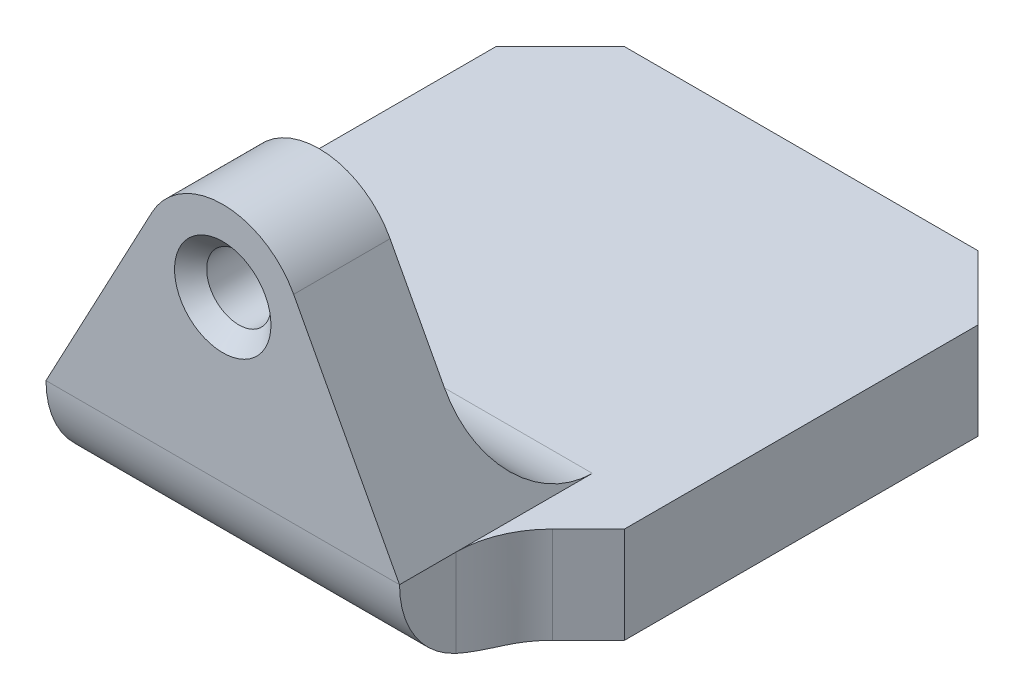
ISO-10303-21;
HEADER;
FILE_DESCRIPTION(('STEP AP214'),'2;1');
FILE_NAME('part.step','',(''),(''),'','','');
FILE_SCHEMA(('AUTOMOTIVE_DESIGN { 1 0 10303 214 1 1 1 1 }'));
ENDSEC;
DATA;
#1=APPLICATION_CONTEXT('core data for automotive mechanical design processes');
#2=APPLICATION_PROTOCOL_DEFINITION('international standard','automotive_design',2000,#1);
#3=PRODUCT_CONTEXT('',#1,'mechanical');
#4=PRODUCT('Part','Part','',(#3));
#5=PRODUCT_RELATED_PRODUCT_CATEGORY('part','',(#4));
#6=PRODUCT_DEFINITION_FORMATION('','',#4);
#7=PRODUCT_DEFINITION_CONTEXT('part definition',#1,'design');
#8=PRODUCT_DEFINITION('design','',#6,#7);
#9=PRODUCT_DEFINITION_SHAPE('','',#8);
#10=(LENGTH_UNIT() NAMED_UNIT(*) SI_UNIT(.MILLI.,.METRE.));
#11=(NAMED_UNIT(*) PLANE_ANGLE_UNIT() SI_UNIT($,.RADIAN.));
#12=(NAMED_UNIT(*) SI_UNIT($,.STERADIAN.) SOLID_ANGLE_UNIT());
#13=UNCERTAINTY_MEASURE_WITH_UNIT(LENGTH_MEASURE(1.E-05),#10,'distance_accuracy_value','');
#14=(GEOMETRIC_REPRESENTATION_CONTEXT(3) GLOBAL_UNCERTAINTY_ASSIGNED_CONTEXT((#13)) GLOBAL_UNIT_ASSIGNED_CONTEXT((#10,
#11,#12)) REPRESENTATION_CONTEXT('',''));
#15=CARTESIAN_POINT('',(0.,0.,0.));
#16=DIRECTION('',(0.,0.,1.));
#17=DIRECTION('',(1.,0.,0.));
#18=AXIS2_PLACEMENT_3D('',#15,#16,#17);
#19=CARTESIAN_POINT('',(15.,6.,-15.));
#20=DIRECTION('',(-1.,0.,0.));
#21=DIRECTION('',(0.,0.,1.));
#22=AXIS2_PLACEMENT_3D('',#19,#20,#21);
#23=PLANE('',#22);
#24=DIRECTION('',(0.,0.,-1.));
#25=VECTOR('',#24,1.);
#26=CARTESIAN_POINT('',(15.,0.,-15.));
#27=LINE('',#26,#25);
#28=CARTESIAN_POINT('',(15.,0.,11.));
#29=VERTEX_POINT('',#28);
#30=CARTESIAN_POINT('',(15.,0.,-11.));
#31=VERTEX_POINT('',#30);
#32=EDGE_CURVE('E183',#29,#31,#27,.T.);
#33=ORIENTED_EDGE('',*,*,#32,.T.);
#34=DIRECTION('',(0.,1.,0.));
#35=VECTOR('',#34,1.);
#36=CARTESIAN_POINT('',(15.,6.,-11.));
#37=LINE('',#36,#35);
#38=CARTESIAN_POINT('',(15.,6.,-11.));
#39=VERTEX_POINT('',#38);
#40=EDGE_CURVE('E177',#31,#39,#37,.T.);
#41=ORIENTED_EDGE('',*,*,#40,.T.);
#42=DIRECTION('',(0.,0.,-1.));
#43=VECTOR('',#42,1.);
#44=CARTESIAN_POINT('',(15.,6.,-15.));
#45=LINE('',#44,#43);
#46=CARTESIAN_POINT('',(15.,6.,11.));
#47=VERTEX_POINT('',#46);
#48=EDGE_CURVE('E206',#47,#39,#45,.T.);
#49=ORIENTED_EDGE('',*,*,#48,.F.);
#50=DIRECTION('',(0.,-1.,0.));
#51=VECTOR('',#50,1.);
#52=CARTESIAN_POINT('',(15.,6.,11.));
#53=LINE('',#52,#51);
#54=EDGE_CURVE('E251',#47,#29,#53,.T.);
#55=ORIENTED_EDGE('',*,*,#54,.T.);
#56=EDGE_LOOP('',(#33,#41,#49,#55));
#57=FACE_BOUND('',#56,.T.);
#58=ADVANCED_FACE('F40',(#57),#23,.F.);
#59=CARTESIAN_POINT('',(-15.,6.,-15.));
#60=DIRECTION('',(0.,0.,1.));
#61=DIRECTION('',(1.,0.,0.));
#62=AXIS2_PLACEMENT_3D('',#59,#60,#61);
#63=PLANE('',#62);
#64=DIRECTION('',(-1.,0.,0.));
#65=VECTOR('',#64,1.);
#66=CARTESIAN_POINT('',(-15.,0.,-15.));
#67=LINE('',#66,#65);
#68=CARTESIAN_POINT('',(11.,0.,-15.));
#69=VERTEX_POINT('',#68);
#70=CARTESIAN_POINT('',(-11.,0.,-15.));
#71=VERTEX_POINT('',#70);
#72=EDGE_CURVE('E219',#69,#71,#67,.T.);
#73=ORIENTED_EDGE('',*,*,#72,.T.);
#74=DIRECTION('',(0.,1.,0.));
#75=VECTOR('',#74,1.);
#76=CARTESIAN_POINT('',(-11.,6.,-15.));
#77=LINE('',#76,#75);
#78=CARTESIAN_POINT('',(-11.,6.,-15.));
#79=VERTEX_POINT('',#78);
#80=EDGE_CURVE('E240',#71,#79,#77,.T.);
#81=ORIENTED_EDGE('',*,*,#80,.T.);
#82=DIRECTION('',(-1.,0.,0.));
#83=VECTOR('',#82,1.);
#84=CARTESIAN_POINT('',(-15.,6.,-15.));
#85=LINE('',#84,#83);
#86=CARTESIAN_POINT('',(11.,6.,-15.));
#87=VERTEX_POINT('',#86);
#88=EDGE_CURVE('E209',#87,#79,#85,.T.);
#89=ORIENTED_EDGE('',*,*,#88,.F.);
#90=DIRECTION('',(0.,-1.,0.));
#91=VECTOR('',#90,1.);
#92=CARTESIAN_POINT('',(11.,6.,-15.));
#93=LINE('',#92,#91);
#94=EDGE_CURVE('E237',#87,#69,#93,.T.);
#95=ORIENTED_EDGE('',*,*,#94,.T.);
#96=EDGE_LOOP('',(#73,#81,#89,#95));
#97=FACE_BOUND('',#96,.T.);
#98=ADVANCED_FACE('F320',(#97),#63,.F.);
#99=CARTESIAN_POINT('',(-15.,6.,-15.));
#100=DIRECTION('',(1.,0.,0.));
#101=DIRECTION('',(0.,0.,-1.));
#102=AXIS2_PLACEMENT_3D('',#99,#100,#101);
#103=PLANE('',#102);
#104=DIRECTION('',(0.,0.,1.));
#105=VECTOR('',#104,1.);
#106=CARTESIAN_POINT('',(-15.,6.,-15.));
#107=LINE('',#106,#105);
#108=CARTESIAN_POINT('',(-15.,6.,-11.));
#109=VERTEX_POINT('',#108);
#110=CARTESIAN_POINT('',(-15.,6.,11.));
#111=VERTEX_POINT('',#110);
#112=EDGE_CURVE('E213',#109,#111,#107,.T.);
#113=ORIENTED_EDGE('',*,*,#112,.F.);
#114=DIRECTION('',(0.,-1.,0.));
#115=VECTOR('',#114,1.);
#116=CARTESIAN_POINT('',(-15.,6.,-11.));
#117=LINE('',#116,#115);
#118=CARTESIAN_POINT('',(-15.,0.,-11.));
#119=VERTEX_POINT('',#118);
#120=EDGE_CURVE('E225',#109,#119,#117,.T.);
#121=ORIENTED_EDGE('',*,*,#120,.T.);
#122=DIRECTION('',(0.,0.,1.));
#123=VECTOR('',#122,1.);
#124=CARTESIAN_POINT('',(-15.,0.,-15.));
#125=LINE('',#124,#123);
#126=CARTESIAN_POINT('',(-15.,0.,11.));
#127=VERTEX_POINT('',#126);
#128=EDGE_CURVE('E210',#119,#127,#125,.T.);
#129=ORIENTED_EDGE('',*,*,#128,.T.);
#130=DIRECTION('',(0.,1.,0.));
#131=VECTOR('',#130,1.);
#132=CARTESIAN_POINT('',(-15.,6.,11.));
#133=LINE('',#132,#131);
#134=EDGE_CURVE('E216',#127,#111,#133,.T.);
#135=ORIENTED_EDGE('',*,*,#134,.T.);
#136=EDGE_LOOP('',(#113,#121,#129,#135));
#137=FACE_BOUND('',#136,.T.);
#138=ADVANCED_FACE('F326',(#137),#103,.F.);
#139=CARTESIAN_POINT('',(0.,6.,0.));
#140=DIRECTION('',(0.,1.,0.));
#141=DIRECTION('',(0.,0.,1.));
#142=AXIS2_PLACEMENT_3D('',#139,#140,#141);
#143=PLANE('',#142);
#144=DIRECTION('',(1.,0.,0.));
#145=VECTOR('',#144,1.);
#146=CARTESIAN_POINT('',(0.,6.,9.));
#147=LINE('',#146,#145);
#148=CARTESIAN_POINT('',(-11.,6.,9.));
#149=VERTEX_POINT('',#148);
#150=CARTESIAN_POINT('',(11.,6.,9.));
#151=VERTEX_POINT('',#150);
#152=EDGE_CURVE('E387',#149,#151,#147,.T.);
#153=ORIENTED_EDGE('',*,*,#152,.T.);
#154=DIRECTION('',(0.,0.,1.));
#155=VECTOR('',#154,1.);
#156=CARTESIAN_POINT('',(11.,6.,0.));
#157=LINE('',#156,#155);
#158=CARTESIAN_POINT('',(11.,6.,17.4852768803211));
#159=VERTEX_POINT('',#158);
#160=EDGE_CURVE('E386',#151,#159,#157,.T.);
#161=ORIENTED_EDGE('',*,*,#160,.T.);
#162=CARTESIAN_POINT('',(17.,6.,17.4852813742386));
#163=DIRECTION('',(0.,1.,0.));
#164=DIRECTION('',(0.,0.,1.));
#165=AXIS2_PLACEMENT_3D('',#162,#163,#164);
#166=CIRCLE('',#165,6.);
#167=CARTESIAN_POINT('',(12.7573593128807,6.,13.2426406871193));
#168=VERTEX_POINT('',#167);
#169=EDGE_CURVE('E361',#159,#168,#166,.F.);
#170=ORIENTED_EDGE('',*,*,#169,.T.);
#171=DIRECTION('',(-0.707106781186548,0.,0.707106781186547));
#172=VECTOR('',#171,1.);
#173=CARTESIAN_POINT('',(13.,6.,13.));
#174=LINE('',#173,#172);
#175=EDGE_CURVE('E245',#168,#47,#174,.F.);
#176=ORIENTED_EDGE('',*,*,#175,.T.);
#177=ORIENTED_EDGE('',*,*,#48,.T.);
#178=DIRECTION('',(0.707106781186546,0.,0.707106781186549));
#179=VECTOR('',#178,1.);
#180=CARTESIAN_POINT('',(13.,6.,-13.));
#181=LINE('',#180,#179);
#182=EDGE_CURVE('E247',#39,#87,#181,.F.);
#183=ORIENTED_EDGE('',*,*,#182,.T.);
#184=ORIENTED_EDGE('',*,*,#88,.T.);
#185=DIRECTION('',(0.707106781186548,0.,-0.707106781186547));
#186=VECTOR('',#185,1.);
#187=CARTESIAN_POINT('',(-13.,6.,-13.));
#188=LINE('',#187,#186);
#189=EDGE_CURVE('E249',#79,#109,#188,.F.);
#190=ORIENTED_EDGE('',*,*,#189,.T.);
#191=ORIENTED_EDGE('',*,*,#112,.T.);
#192=DIRECTION('',(-0.707106781186547,0.,-0.707106781186548));
#193=VECTOR('',#192,1.);
#194=CARTESIAN_POINT('',(-13.,6.,13.));
#195=LINE('',#194,#193);
#196=CARTESIAN_POINT('',(-12.7573593128807,6.,13.2426406871193));
#197=VERTEX_POINT('',#196);
#198=EDGE_CURVE('E242',#111,#197,#195,.F.);
#199=ORIENTED_EDGE('',*,*,#198,.T.);
#200=CARTESIAN_POINT('',(-17.,6.,17.4852813742386));
#201=DIRECTION('',(0.,1.,0.));
#202=DIRECTION('',(0.,0.,1.));
#203=AXIS2_PLACEMENT_3D('',#200,#201,#202);
#204=CIRCLE('',#203,6.);
#205=CARTESIAN_POINT('',(-11.,6.,17.4852813742386));
#206=VERTEX_POINT('',#205);
#207=EDGE_CURVE('E365',#197,#206,#204,.F.);
#208=ORIENTED_EDGE('',*,*,#207,.T.);
#209=DIRECTION('',(0.,0.,1.));
#210=VECTOR('',#209,1.);
#211=CARTESIAN_POINT('',(-11.,6.,21.));
#212=LINE('',#211,#210);
#213=EDGE_CURVE('E295',#149,#206,#212,.T.);
#214=ORIENTED_EDGE('',*,*,#213,.F.);
#215=EDGE_LOOP('',(#153,#161,#170,#176,#177,#183,#184,#190,#191,#199,#208,#214));
#216=FACE_BOUND('',#215,.T.);
#217=ADVANCED_FACE('F427',(#216),#143,.T.);
#218=CARTESIAN_POINT('',(0.,0.,0.));
#219=DIRECTION('',(0.,1.,0.));
#220=DIRECTION('',(0.,0.,1.));
#221=AXIS2_PLACEMENT_3D('',#218,#219,#220);
#222=PLANE('',#221);
#223=DIRECTION('',(0.707106781186548,0.,-0.707106781186547));
#224=VECTOR('',#223,1.);
#225=CARTESIAN_POINT('',(15.,0.,11.));
#226=LINE('',#225,#224);
#227=CARTESIAN_POINT('',(12.7573593128807,0.,13.2426406871193));
#228=VERTEX_POINT('',#227);
#229=EDGE_CURVE('E230',#29,#228,#226,.F.);
#230=ORIENTED_EDGE('',*,*,#229,.T.);
#231=CARTESIAN_POINT('',(17.,0.,17.4852813742386));
#232=DIRECTION('',(0.,1.,0.));
#233=DIRECTION('',(0.,0.,1.));
#234=AXIS2_PLACEMENT_3D('',#231,#232,#233);
#235=CIRCLE('',#234,6.);
#236=CARTESIAN_POINT('',(11.5389216732533,0.,15.));
#237=VERTEX_POINT('',#236);
#238=EDGE_CURVE('E296',#228,#237,#235,.T.);
#239=ORIENTED_EDGE('',*,*,#238,.T.);
#240=DIRECTION('',(1.,0.,0.));
#241=VECTOR('',#240,1.);
#242=CARTESIAN_POINT('',(-11.,0.,15.));
#243=LINE('',#242,#241);
#244=CARTESIAN_POINT('',(-11.5389216732533,0.,15.));
#245=VERTEX_POINT('',#244);
#246=EDGE_CURVE('E166',#237,#245,#243,.F.);
#247=ORIENTED_EDGE('',*,*,#246,.T.);
#248=CARTESIAN_POINT('',(-17.,0.,17.4852813742386));
#249=DIRECTION('',(0.,1.,0.));
#250=DIRECTION('',(0.,0.,1.));
#251=AXIS2_PLACEMENT_3D('',#248,#249,#250);
#252=CIRCLE('',#251,6.);
#253=CARTESIAN_POINT('',(-12.7573593128807,0.,13.2426406871193));
#254=VERTEX_POINT('',#253);
#255=EDGE_CURVE('E275',#245,#254,#252,.T.);
#256=ORIENTED_EDGE('',*,*,#255,.T.);
#257=DIRECTION('',(0.707106781186547,0.,0.707106781186548));
#258=VECTOR('',#257,1.);
#259=CARTESIAN_POINT('',(-11.,0.,15.));
#260=LINE('',#259,#258);
#261=EDGE_CURVE('E228',#254,#127,#260,.F.);
#262=ORIENTED_EDGE('',*,*,#261,.T.);
#263=ORIENTED_EDGE('',*,*,#128,.F.);
#264=DIRECTION('',(-0.707106781186548,0.,0.707106781186547));
#265=VECTOR('',#264,1.);
#266=CARTESIAN_POINT('',(-15.,0.,-11.));
#267=LINE('',#266,#265);
#268=EDGE_CURVE('E235',#119,#71,#267,.F.);
#269=ORIENTED_EDGE('',*,*,#268,.T.);
#270=ORIENTED_EDGE('',*,*,#72,.F.);
#271=DIRECTION('',(-0.707106781186546,0.,-0.707106781186549));
#272=VECTOR('',#271,1.);
#273=CARTESIAN_POINT('',(11.,0.,-15.));
#274=LINE('',#273,#272);
#275=EDGE_CURVE('E233',#69,#31,#274,.F.);
#276=ORIENTED_EDGE('',*,*,#275,.T.);
#277=ORIENTED_EDGE('',*,*,#32,.F.);
#278=EDGE_LOOP('',(#230,#239,#247,#256,#262,#263,#269,#270,#276,#277));
#279=FACE_BOUND('',#278,.T.);
#280=ADVANCED_FACE('F339',(#279),#222,.F.);
#281=CARTESIAN_POINT('',(-15.,6.,-11.));
#282=DIRECTION('',(0.707106781186547,0.,0.707106781186548));
#283=DIRECTION('',(0.,-1.,0.));
#284=AXIS2_PLACEMENT_3D('',#281,#282,#283);
#285=PLANE('',#284);
#286=ORIENTED_EDGE('',*,*,#189,.F.);
#287=ORIENTED_EDGE('',*,*,#80,.F.);
#288=ORIENTED_EDGE('',*,*,#268,.F.);
#289=ORIENTED_EDGE('',*,*,#120,.F.);
#290=EDGE_LOOP('',(#286,#287,#288,#289));
#291=FACE_BOUND('',#290,.T.);
#292=ADVANCED_FACE('F332',(#291),#285,.F.);
#293=CARTESIAN_POINT('',(11.,6.,-15.));
#294=DIRECTION('',(-0.707106781186549,0.,0.707106781186546));
#295=DIRECTION('',(0.,-1.,0.));
#296=AXIS2_PLACEMENT_3D('',#293,#294,#295);
#297=PLANE('',#296);
#298=ORIENTED_EDGE('',*,*,#182,.F.);
#299=ORIENTED_EDGE('',*,*,#40,.F.);
#300=ORIENTED_EDGE('',*,*,#275,.F.);
#301=ORIENTED_EDGE('',*,*,#94,.F.);
#302=EDGE_LOOP('',(#298,#299,#300,#301));
#303=FACE_BOUND('',#302,.T.);
#304=ADVANCED_FACE('F338',(#303),#297,.F.);
#305=CARTESIAN_POINT('',(15.,6.,11.));
#306=DIRECTION('',(-0.707106781186547,0.,-0.707106781186548));
#307=DIRECTION('',(0.,-1.,0.));
#308=AXIS2_PLACEMENT_3D('',#305,#306,#307);
#309=PLANE('',#308);
#310=ORIENTED_EDGE('',*,*,#175,.F.);
#311=DIRECTION('',(0.,1.,0.));
#312=VECTOR('',#311,1.);
#313=CARTESIAN_POINT('',(12.7573593128807,6.,13.2426406871193));
#314=LINE('',#313,#312);
#315=EDGE_CURVE('E264',#168,#228,#314,.F.);
#316=ORIENTED_EDGE('',*,*,#315,.T.);
#317=ORIENTED_EDGE('',*,*,#229,.F.);
#318=ORIENTED_EDGE('',*,*,#54,.F.);
#319=EDGE_LOOP('',(#310,#316,#317,#318));
#320=FACE_BOUND('',#319,.T.);
#321=ADVANCED_FACE('F345',(#320),#309,.F.);
#322=CARTESIAN_POINT('',(-11.,6.,15.));
#323=DIRECTION('',(0.707106781186548,0.,-0.707106781186547));
#324=DIRECTION('',(0.,-1.,0.));
#325=AXIS2_PLACEMENT_3D('',#322,#323,#324);
#326=PLANE('',#325);
#327=ORIENTED_EDGE('',*,*,#261,.F.);
#328=DIRECTION('',(0.,-1.,0.));
#329=VECTOR('',#328,1.);
#330=CARTESIAN_POINT('',(-12.7573593128807,6.,13.2426406871193));
#331=LINE('',#330,#329);
#332=EDGE_CURVE('E261',#254,#197,#331,.F.);
#333=ORIENTED_EDGE('',*,*,#332,.T.);
#334=ORIENTED_EDGE('',*,*,#198,.F.);
#335=ORIENTED_EDGE('',*,*,#134,.F.);
#336=EDGE_LOOP('',(#327,#333,#334,#335));
#337=FACE_BOUND('',#336,.T.);
#338=ADVANCED_FACE('F285',(#337),#326,.F.);
#339=CARTESIAN_POINT('',(0.,16.,21.));
#340=DIRECTION('',(0.,0.,1.));
#341=DIRECTION('',(1.,0.,0.));
#342=AXIS2_PLACEMENT_3D('',#339,#340,#341);
#343=PLANE('',#342);
#344=CARTESIAN_POINT('',(0.,16.,21.));
#345=DIRECTION('',(0.,0.,1.));
#346=DIRECTION('',(1.,0.,0.));
#347=AXIS2_PLACEMENT_3D('',#344,#345,#346);
#348=CIRCLE('',#347,3.);
#349=CARTESIAN_POINT('',(3.,16.,21.));
#350=VERTEX_POINT('',#349);
#351=EDGE_CURVE('E11',#350,#350,#348,.F.);
#352=ORIENTED_EDGE('',*,*,#351,.T.);
#353=EDGE_LOOP('',(#352));
#354=FACE_BOUND('',#353,.T.);
#355=DIRECTION('',(-0.470588235294117,-0.882352941176471,0.));
#356=VECTOR('',#355,1.);
#357=CARTESIAN_POINT('',(-11.,6.,21.));
#358=LINE('',#357,#356);
#359=CARTESIAN_POINT('',(-4.41176470588235,18.3529411764706,21.));
#360=VERTEX_POINT('',#359);
#361=CARTESIAN_POINT('',(-11.,6.,21.));
#362=VERTEX_POINT('',#361);
#363=EDGE_CURVE('E175',#360,#362,#358,.T.);
#364=ORIENTED_EDGE('',*,*,#363,.T.);
#365=DIRECTION('',(1.,0.,0.));
#366=VECTOR('',#365,1.);
#367=CARTESIAN_POINT('',(11.,6.,21.));
#368=LINE('',#367,#366);
#369=CARTESIAN_POINT('',(11.,6.,21.));
#370=VERTEX_POINT('',#369);
#371=EDGE_CURVE('E159',#362,#370,#368,.T.);
#372=ORIENTED_EDGE('',*,*,#371,.T.);
#373=DIRECTION('',(-0.470588235294117,0.882352941176471,0.));
#374=VECTOR('',#373,1.);
#375=CARTESIAN_POINT('',(11.,6.,21.));
#376=LINE('',#375,#374);
#377=CARTESIAN_POINT('',(4.41176470588235,18.3529411764706,21.));
#378=VERTEX_POINT('',#377);
#379=EDGE_CURVE('E172',#370,#378,#376,.T.);
#380=ORIENTED_EDGE('',*,*,#379,.T.);
#381=CARTESIAN_POINT('',(0.,16.,21.));
#382=DIRECTION('',(0.,0.,1.));
#383=DIRECTION('',(1.,0.,0.));
#384=AXIS2_PLACEMENT_3D('',#381,#382,#383);
#385=CIRCLE('',#384,5.);
#386=EDGE_CURVE('E189',#378,#360,#385,.T.);
#387=ORIENTED_EDGE('',*,*,#386,.T.);
#388=EDGE_LOOP('',(#364,#372,#380,#387));
#389=FACE_BOUND('',#388,.T.);
#390=ADVANCED_FACE('F170',(#354,#389),#343,.T.);
#391=CARTESIAN_POINT('',(0.,16.,15.));
#392=DIRECTION('',(0.,0.,1.));
#393=DIRECTION('',(1.,0.,0.));
#394=AXIS2_PLACEMENT_3D('',#391,#392,#393);
#395=PLANE('',#394);
#396=CARTESIAN_POINT('',(0.,16.,15.));
#397=DIRECTION('',(0.,0.,1.));
#398=DIRECTION('',(1.,0.,0.));
#399=AXIS2_PLACEMENT_3D('',#396,#397,#398);
#400=CIRCLE('',#399,2.99999999999999);
#401=CARTESIAN_POINT('',(2.99999999999999,16.,15.));
#402=VERTEX_POINT('',#401);
#403=EDGE_CURVE('E393',#402,#402,#400,.T.);
#404=ORIENTED_EDGE('',*,*,#403,.T.);
#405=EDGE_LOOP('',(#404));
#406=FACE_BOUND('',#405,.T.);
#407=DIRECTION('',(-0.470588235294117,0.882352941176471,0.));
#408=VECTOR('',#407,1.);
#409=CARTESIAN_POINT('',(11.,6.,15.));
#410=LINE('',#409,#408);
#411=CARTESIAN_POINT('',(7.8,12.,15.));
#412=VERTEX_POINT('',#411);
#413=CARTESIAN_POINT('',(4.41176470588235,18.3529411764706,15.));
#414=VERTEX_POINT('',#413);
#415=EDGE_CURVE('E198',#412,#414,#410,.T.);
#416=ORIENTED_EDGE('',*,*,#415,.F.);
#417=DIRECTION('',(1.,0.,0.));
#418=VECTOR('',#417,1.);
#419=CARTESIAN_POINT('',(0.,12.,15.));
#420=LINE('',#419,#418);
#421=CARTESIAN_POINT('',(-7.8,12.,15.));
#422=VERTEX_POINT('',#421);
#423=EDGE_CURVE('E63',#412,#422,#420,.F.);
#424=ORIENTED_EDGE('',*,*,#423,.T.);
#425=DIRECTION('',(-0.470588235294117,-0.882352941176471,0.));
#426=VECTOR('',#425,1.);
#427=CARTESIAN_POINT('',(-11.,6.,15.));
#428=LINE('',#427,#426);
#429=CARTESIAN_POINT('',(-4.41176470588235,18.3529411764706,15.));
#430=VERTEX_POINT('',#429);
#431=EDGE_CURVE('E190',#430,#422,#428,.T.);
#432=ORIENTED_EDGE('',*,*,#431,.F.);
#433=CARTESIAN_POINT('',(0.,16.,15.));
#434=DIRECTION('',(0.,0.,1.));
#435=DIRECTION('',(1.,0.,0.));
#436=AXIS2_PLACEMENT_3D('',#433,#434,#435);
#437=CIRCLE('',#436,5.);
#438=EDGE_CURVE('E193',#414,#430,#437,.T.);
#439=ORIENTED_EDGE('',*,*,#438,.F.);
#440=EDGE_LOOP('',(#416,#424,#432,#439));
#441=FACE_BOUND('',#440,.T.);
#442=ADVANCED_FACE('F413',(#406,#441),#395,.F.);
#443=CARTESIAN_POINT('',(-11.,6.,21.));
#444=DIRECTION('',(1.,0.,0.));
#445=DIRECTION('',(0.,0.,-1.));
#446=AXIS2_PLACEMENT_3D('',#443,#444,#445);
#447=PLANE('',#446);
#448=DIRECTION('',(0.,0.,-1.));
#449=VECTOR('',#448,1.);
#450=CARTESIAN_POINT('',(-11.,6.,21.));
#451=LINE('',#450,#449);
#452=EDGE_CURVE('E197',#362,#206,#451,.T.);
#453=ORIENTED_EDGE('',*,*,#452,.T.);
#454=DIRECTION('',(0.,1.,0.));
#455=VECTOR('',#454,1.);
#456=CARTESIAN_POINT('',(-11.,6.,17.4852813742386));
#457=LINE('',#456,#455);
#458=CARTESIAN_POINT('',(-11.,0.53892167325327,17.4852813742386));
#459=VERTEX_POINT('',#458);
#460=EDGE_CURVE('E258',#206,#459,#457,.F.);
#461=ORIENTED_EDGE('',*,*,#460,.T.);
#462=CARTESIAN_POINT('',(-11.,6.,15.));
#463=DIRECTION('',(1.,0.,0.));
#464=DIRECTION('',(0.,0.,-1.));
#465=AXIS2_PLACEMENT_3D('',#462,#463,#464);
#466=CIRCLE('',#465,6.);
#467=EDGE_CURVE('E256',#459,#362,#466,.F.);
#468=ORIENTED_EDGE('',*,*,#467,.T.);
#469=EDGE_LOOP('',(#453,#461,#468));
#470=FACE_BOUND('',#469,.T.);
#471=ADVANCED_FACE('F378',(#470),#447,.F.);
#472=CARTESIAN_POINT('',(11.,0.,21.));
#473=DIRECTION('',(-1.,0.,0.));
#474=DIRECTION('',(0.,0.,1.));
#475=AXIS2_PLACEMENT_3D('',#472,#473,#474);
#476=PLANE('',#475);
#477=CARTESIAN_POINT('',(11.,6.,15.));
#478=DIRECTION('',(-1.,0.,0.));
#479=DIRECTION('',(0.,0.,1.));
#480=AXIS2_PLACEMENT_3D('',#477,#478,#479);
#481=CIRCLE('',#480,6.);
#482=CARTESIAN_POINT('',(11.,0.538921673253274,17.4852813742386));
#483=VERTEX_POINT('',#482);
#484=EDGE_CURVE('E155',#370,#483,#481,.F.);
#485=ORIENTED_EDGE('',*,*,#484,.T.);
#486=DIRECTION('',(0.,-1.,0.));
#487=VECTOR('',#486,1.);
#488=CARTESIAN_POINT('',(11.,0.,17.4852813742386));
#489=LINE('',#488,#487);
#490=EDGE_CURVE('E182',#483,#159,#489,.F.);
#491=ORIENTED_EDGE('',*,*,#490,.T.);
#492=DIRECTION('',(0.,0.,-1.));
#493=VECTOR('',#492,1.);
#494=CARTESIAN_POINT('',(11.,6.,21.));
#495=LINE('',#494,#493);
#496=EDGE_CURVE('E180',#370,#159,#495,.T.);
#497=ORIENTED_EDGE('',*,*,#496,.F.);
#498=EDGE_LOOP('',(#485,#491,#497));
#499=FACE_BOUND('',#498,.T.);
#500=ADVANCED_FACE('F181',(#499),#476,.F.);
#501=CARTESIAN_POINT('',(11.,6.,21.));
#502=DIRECTION('',(-0.882352941176471,-0.470588235294117,0.));
#503=DIRECTION('',(0.470588235294117,-0.882352941176471,0.));
#504=AXIS2_PLACEMENT_3D('',#501,#502,#503);
#505=PLANE('',#504);
#506=ORIENTED_EDGE('',*,*,#160,.F.);
#507=CARTESIAN_POINT('',(7.8,12.,9.));
#508=DIRECTION('',(-0.882352941176471,-0.470588235294117,0.));
#509=DIRECTION('',(0.470588235294117,-0.882352941176471,0.));
#510=AXIS2_PLACEMENT_3D('',#507,#508,#509);
#511=ELLIPSE('',#510,6.8,6.);
#512=EDGE_CURVE('E56',#151,#412,#511,.T.);
#513=ORIENTED_EDGE('',*,*,#512,.T.);
#514=ORIENTED_EDGE('',*,*,#415,.T.);
#515=DIRECTION('',(0.,0.,-1.));
#516=VECTOR('',#515,1.);
#517=CARTESIAN_POINT('',(4.41176470588235,18.3529411764706,21.));
#518=LINE('',#517,#516);
#519=EDGE_CURVE('E184',#378,#414,#518,.T.);
#520=ORIENTED_EDGE('',*,*,#519,.F.);
#521=ORIENTED_EDGE('',*,*,#379,.F.);
#522=ORIENTED_EDGE('',*,*,#496,.T.);
#523=EDGE_LOOP('',(#506,#513,#514,#520,#521,#522));
#524=FACE_BOUND('',#523,.T.);
#525=ADVANCED_FACE('F186',(#524),#505,.F.);
#526=CARTESIAN_POINT('',(0.,16.,21.));
#527=DIRECTION('',(0.,0.,-1.));
#528=DIRECTION('',(-1.,0.,0.));
#529=AXIS2_PLACEMENT_3D('',#526,#527,#528);
#530=CYLINDRICAL_SURFACE('',#529,5.);
#531=ORIENTED_EDGE('',*,*,#438,.T.);
#532=DIRECTION('',(0.,0.,-1.));
#533=VECTOR('',#532,1.);
#534=CARTESIAN_POINT('',(-4.41176470588235,18.3529411764706,21.));
#535=LINE('',#534,#533);
#536=EDGE_CURVE('E202',#360,#430,#535,.T.);
#537=ORIENTED_EDGE('',*,*,#536,.F.);
#538=ORIENTED_EDGE('',*,*,#386,.F.);
#539=ORIENTED_EDGE('',*,*,#519,.T.);
#540=EDGE_LOOP('',(#531,#537,#538,#539));
#541=FACE_BOUND('',#540,.T.);
#542=ADVANCED_FACE('F408',(#541),#530,.T.);
#543=CARTESIAN_POINT('',(-11.,6.,21.));
#544=DIRECTION('',(0.882352941176471,-0.470588235294117,0.));
#545=DIRECTION('',(0.470588235294117,0.882352941176471,0.));
#546=AXIS2_PLACEMENT_3D('',#543,#544,#545);
#547=PLANE('',#546);
#548=ORIENTED_EDGE('',*,*,#431,.T.);
#549=CARTESIAN_POINT('',(-7.79999999999999,12.,9.));
#550=DIRECTION('',(0.882352941176471,-0.470588235294117,0.));
#551=DIRECTION('',(0.470588235294117,0.882352941176471,0.));
#552=AXIS2_PLACEMENT_3D('',#549,#550,#551);
#553=ELLIPSE('',#552,6.8,6.);
#554=EDGE_CURVE('E383',#422,#149,#553,.T.);
#555=ORIENTED_EDGE('',*,*,#554,.T.);
#556=ORIENTED_EDGE('',*,*,#213,.T.);
#557=ORIENTED_EDGE('',*,*,#452,.F.);
#558=ORIENTED_EDGE('',*,*,#363,.F.);
#559=ORIENTED_EDGE('',*,*,#536,.T.);
#560=EDGE_LOOP('',(#548,#555,#556,#557,#558,#559));
#561=FACE_BOUND('',#560,.T.);
#562=ADVANCED_FACE('F380',(#561),#547,.F.);
#563=CARTESIAN_POINT('',(0.,16.,21.));
#564=DIRECTION('',(0.,0.,-1.));
#565=DIRECTION('',(-1.,0.,0.));
#566=AXIS2_PLACEMENT_3D('',#563,#564,#565);
#567=CYLINDRICAL_SURFACE('',#566,2.);
#568=CARTESIAN_POINT('',(0.,16.,16.));
#569=DIRECTION('',(0.,0.,1.));
#570=DIRECTION('',(1.,0.,0.));
#571=AXIS2_PLACEMENT_3D('',#568,#569,#570);
#572=CIRCLE('',#571,2.);
#573=CARTESIAN_POINT('',(2.,16.,16.));
#574=VERTEX_POINT('',#573);
#575=EDGE_CURVE('E49',#574,#574,#572,.F.);
#576=ORIENTED_EDGE('',*,*,#575,.T.);
#577=EDGE_LOOP('',(#576));
#578=FACE_BOUND('',#577,.T.);
#579=CARTESIAN_POINT('',(0.,16.,20.));
#580=DIRECTION('',(0.,0.,1.));
#581=DIRECTION('',(1.,0.,0.));
#582=AXIS2_PLACEMENT_3D('',#579,#580,#581);
#583=CIRCLE('',#582,2.);
#584=CARTESIAN_POINT('',(2.,16.,20.));
#585=VERTEX_POINT('',#584);
#586=EDGE_CURVE('E396',#585,#585,#583,.T.);
#587=ORIENTED_EDGE('',*,*,#586,.T.);
#588=EDGE_LOOP('',(#587));
#589=FACE_BOUND('',#588,.T.);
#590=ADVANCED_FACE('F283',(#578,#589),#567,.F.);
#591=CARTESIAN_POINT('',(0.,6.,15.));
#592=DIRECTION('',(-1.,0.,0.));
#593=DIRECTION('',(0.,0.,1.));
#594=AXIS2_PLACEMENT_3D('',#591,#592,#593);
#595=CYLINDRICAL_SURFACE('',#594,6.);
#596=ORIENTED_EDGE('',*,*,#467,.F.);
#597=CARTESIAN_POINT('',(-11.,0.538921673253271,17.4852813742386));
#598=CARTESIAN_POINT('',(-10.9999782992568,0.486643633259682,17.3704673535336));
#599=CARTESIAN_POINT('',(-11.0032952846151,0.438022843101594,17.2539654664438));
#600=CARTESIAN_POINT('',(-11.0170299703672,0.348308527768416,17.0184619256618));
#601=CARTESIAN_POINT('',(-11.0274502879481,0.307217784083756,16.8994593662776));
#602=CARTESIAN_POINT('',(-11.0554615859809,0.233743841777836,16.6629062308248));
#603=CARTESIAN_POINT('',(-11.0728670767417,0.201168886790695,16.5453935625852));
#604=CARTESIAN_POINT('',(-11.1150311288438,0.14348269496728,16.3099266018269));
#605=CARTESIAN_POINT('',(-11.1397870724072,0.118368807318526,16.1919724812684));
#606=CARTESIAN_POINT('',(-11.2120015869699,0.0640808177235439,15.8935791733981));
#607=CARTESIAN_POINT('',(-11.2645249953001,0.039894202554015,15.7133922929657));
#608=CARTESIAN_POINT('',(-11.3567813548557,0.0158175240948467,15.444857786813));
#609=CARTESIAN_POINT('',(-11.3901739771328,0.00982940623754802,15.3547647481644));
#610=CARTESIAN_POINT('',(-11.4613106897818,0.00192029367455884,15.1761351900707));
#611=CARTESIAN_POINT('',(-11.4990545576613,-9.08887562689695E-07,15.0875985913066));
#612=CARTESIAN_POINT('',(-11.5389216732533,0.,15.));
#613=B_SPLINE_CURVE_WITH_KNOTS('',3,(#597,#598,#599,#600,#601,#602,#603,#604,#605,#606,#607,
#608,#609,#610,#611,#612),.UNSPECIFIED.,.F.,.F.,(4,2,2,2,2,2,2,4),(0.,0.378389675087071,
0.756918841351102,1.12599903019019,1.49494793277166,2.06082257011489,2.34946570702562,
2.63809409128561),.UNSPECIFIED.);
#614=EDGE_CURVE('E266',#459,#245,#613,.T.);
#615=ORIENTED_EDGE('',*,*,#614,.T.);
#616=ORIENTED_EDGE('',*,*,#246,.F.);
#617=CARTESIAN_POINT('',(11.5389216732533,0.,15.));
#618=CARTESIAN_POINT('',(11.4866436332597,-2.17007431988426E-05,15.1148140207049));
#619=CARTESIAN_POINT('',(11.4380228431016,0.00329528461509518,15.2313159077948));
#620=CARTESIAN_POINT('',(11.3483085277684,0.0170299703672401,15.4668194485768));
#621=CARTESIAN_POINT('',(11.3072177840838,0.027450287948067,15.585822007961));
#622=CARTESIAN_POINT('',(11.2337438417778,0.0554615859808684,15.8223751434138));
#623=CARTESIAN_POINT('',(11.2011688867907,0.0728670767417157,15.9398878116534));
#624=CARTESIAN_POINT('',(11.1434826949673,0.11503112884381,16.1753547724116));
#625=CARTESIAN_POINT('',(11.1183688073185,0.13978707240717,16.2933088929702));
#626=CARTESIAN_POINT('',(11.0640808177235,0.212001586969933,16.5917022008405));
#627=CARTESIAN_POINT('',(11.039894202554,0.264524995300159,16.7718890812729));
#628=CARTESIAN_POINT('',(11.0158175240948,0.356781354855721,17.0404235874256));
#629=CARTESIAN_POINT('',(11.0098294062375,0.390173977132838,17.1305166260742));
#630=CARTESIAN_POINT('',(11.0019202936746,0.461310689781783,17.3091461841679));
#631=CARTESIAN_POINT('',(10.9999990911124,0.499054557661339,17.3976827829319));
#632=CARTESIAN_POINT('',(11.,0.538921673253274,17.4852813742386));
#633=B_SPLINE_CURVE_WITH_KNOTS('',3,(#617,#618,#619,#620,#621,#622,#623,#624,#625,#626,#627,
#628,#629,#630,#631,#632),.UNSPECIFIED.,.F.,.F.,(4,2,2,2,2,2,2,4),(0.,0.378389675087075,
0.756918841351104,1.12599903019019,1.49494793277166,2.0608225701149,2.34946570702563,
2.63809409128562),.UNSPECIFIED.);
#634=EDGE_CURVE('E161',#237,#483,#633,.T.);
#635=ORIENTED_EDGE('',*,*,#634,.T.);
#636=ORIENTED_EDGE('',*,*,#484,.F.);
#637=ORIENTED_EDGE('',*,*,#371,.F.);
#638=EDGE_LOOP('',(#596,#615,#616,#635,#636,#637));
#639=FACE_BOUND('',#638,.T.);
#640=ADVANCED_FACE('F158',(#639),#595,.T.);
#641=CARTESIAN_POINT('',(-17.,6.,17.4852813742386));
#642=DIRECTION('',(0.,1.,0.));
#643=DIRECTION('',(0.,0.,1.));
#644=AXIS2_PLACEMENT_3D('',#641,#642,#643);
#645=CYLINDRICAL_SURFACE('',#644,6.);
#646=ORIENTED_EDGE('',*,*,#207,.F.);
#647=ORIENTED_EDGE('',*,*,#332,.F.);
#648=ORIENTED_EDGE('',*,*,#255,.F.);
#649=ORIENTED_EDGE('',*,*,#614,.F.);
#650=ORIENTED_EDGE('',*,*,#460,.F.);
#651=EDGE_LOOP('',(#646,#647,#648,#649,#650));
#652=FACE_BOUND('',#651,.T.);
#653=ADVANCED_FACE('F277',(#652),#645,.F.);
#654=CARTESIAN_POINT('',(17.,0.,17.4852813742386));
#655=DIRECTION('',(0.,-1.,0.));
#656=DIRECTION('',(0.,0.,-1.));
#657=AXIS2_PLACEMENT_3D('',#654,#655,#656);
#658=CYLINDRICAL_SURFACE('',#657,6.);
#659=ORIENTED_EDGE('',*,*,#238,.F.);
#660=ORIENTED_EDGE('',*,*,#315,.F.);
#661=ORIENTED_EDGE('',*,*,#169,.F.);
#662=ORIENTED_EDGE('',*,*,#490,.F.);
#663=ORIENTED_EDGE('',*,*,#634,.F.);
#664=EDGE_LOOP('',(#659,#660,#661,#662,#663));
#665=FACE_BOUND('',#664,.T.);
#666=ADVANCED_FACE('F299',(#665),#658,.F.);
#667=CARTESIAN_POINT('',(0.,12.,9.));
#668=DIRECTION('',(1.,0.,0.));
#669=DIRECTION('',(0.,0.,-1.));
#670=AXIS2_PLACEMENT_3D('',#667,#668,#669);
#671=CYLINDRICAL_SURFACE('',#670,6.);
#672=ORIENTED_EDGE('',*,*,#554,.F.);
#673=ORIENTED_EDGE('',*,*,#423,.F.);
#674=ORIENTED_EDGE('',*,*,#512,.F.);
#675=ORIENTED_EDGE('',*,*,#152,.F.);
#676=EDGE_LOOP('',(#672,#673,#674,#675));
#677=FACE_BOUND('',#676,.T.);
#678=ADVANCED_FACE('F303',(#677),#671,.F.);
#679=CARTESIAN_POINT('',(0.,16.,15.));
#680=DIRECTION('',(0.,0.,-1.));
#681=DIRECTION('',(-1.,0.,0.));
#682=AXIS2_PLACEMENT_3D('',#679,#680,#681);
#683=CONICAL_SURFACE('',#682,2.99999999999999,0.785398163397446);
#684=ORIENTED_EDGE('',*,*,#575,.F.);
#685=EDGE_LOOP('',(#684));
#686=FACE_BOUND('',#685,.T.);
#687=ORIENTED_EDGE('',*,*,#403,.F.);
#688=EDGE_LOOP('',(#687));
#689=FACE_BOUND('',#688,.T.);
#690=ADVANCED_FACE('F306',(#686,#689),#683,.F.);
#691=CARTESIAN_POINT('',(0.,16.,20.));
#692=DIRECTION('',(0.,0.,1.));
#693=DIRECTION('',(1.,0.,0.));
#694=AXIS2_PLACEMENT_3D('',#691,#692,#693);
#695=CONICAL_SURFACE('',#694,2.,0.785398163397452);
#696=ORIENTED_EDGE('',*,*,#351,.F.);
#697=EDGE_LOOP('',(#696));
#698=FACE_BOUND('',#697,.T.);
#699=ORIENTED_EDGE('',*,*,#586,.F.);
#700=EDGE_LOOP('',(#699));
#701=FACE_BOUND('',#700,.T.);
#702=ADVANCED_FACE('F43',(#698,#701),#695,.F.);
#703=CLOSED_SHELL('',(#58,#98,#138,#217,#280,#292,#304,#321,#338,#390,#442,#471,#500,#525,#542,
#562,#590,#640,#653,#666,#678,#690,#702));
#704=MANIFOLD_SOLID_BREP('B2',#703);
#705=ADVANCED_BREP_SHAPE_REPRESENTATION('',(#18,#704),#14);
#706=SHAPE_DEFINITION_REPRESENTATION(#9,#705);
ENDSEC;
END-ISO-10303-21;
